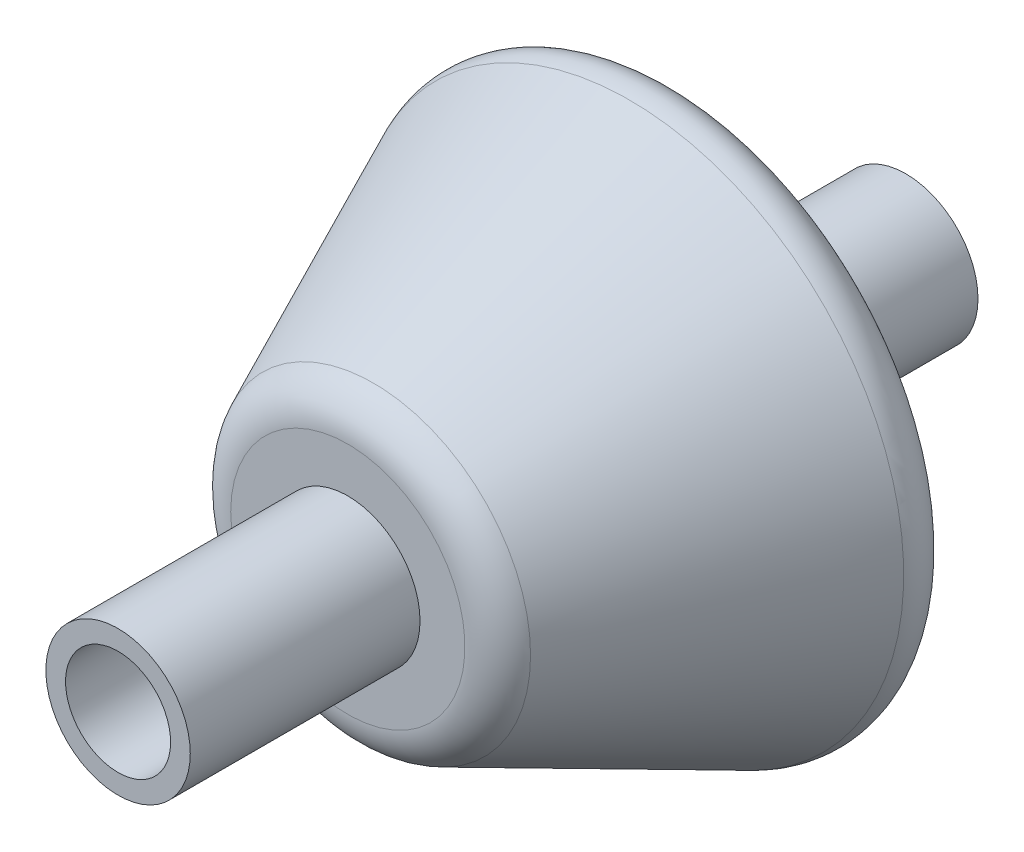
ISO-10303-21;
HEADER;
FILE_DESCRIPTION(('STEP AP214'),'2;1');
FILE_NAME('part.step','',(''),(''),'','','');
FILE_SCHEMA(('AUTOMOTIVE_DESIGN { 1 0 10303 214 1 1 1 1 }'));
ENDSEC;
DATA;
#1=APPLICATION_CONTEXT('core data for automotive mechanical design processes');
#2=APPLICATION_PROTOCOL_DEFINITION('international standard','automotive_design',2000,#1);
#3=PRODUCT_CONTEXT('',#1,'mechanical');
#4=PRODUCT('Part','Part','',(#3));
#5=PRODUCT_RELATED_PRODUCT_CATEGORY('part','',(#4));
#6=PRODUCT_DEFINITION_FORMATION('','',#4);
#7=PRODUCT_DEFINITION_CONTEXT('part definition',#1,'design');
#8=PRODUCT_DEFINITION('design','',#6,#7);
#9=PRODUCT_DEFINITION_SHAPE('','',#8);
#10=(LENGTH_UNIT() NAMED_UNIT(*) SI_UNIT(.MILLI.,.METRE.));
#11=(NAMED_UNIT(*) PLANE_ANGLE_UNIT() SI_UNIT($,.RADIAN.));
#12=(NAMED_UNIT(*) SI_UNIT($,.STERADIAN.) SOLID_ANGLE_UNIT());
#13=UNCERTAINTY_MEASURE_WITH_UNIT(LENGTH_MEASURE(1.E-05),#10,'distance_accuracy_value','');
#14=(GEOMETRIC_REPRESENTATION_CONTEXT(3) GLOBAL_UNCERTAINTY_ASSIGNED_CONTEXT((#13)) GLOBAL_UNIT_ASSIGNED_CONTEXT((#10,
#11,#12)) REPRESENTATION_CONTEXT('',''));
#15=CARTESIAN_POINT('',(0.,0.,0.));
#16=DIRECTION('',(0.,0.,1.));
#17=DIRECTION('',(1.,0.,0.));
#18=AXIS2_PLACEMENT_3D('',#15,#16,#17);
#19=CARTESIAN_POINT('',(0.,0.,60.));
#20=DIRECTION('',(0.,0.,-1.));
#21=DIRECTION('',(-1.,0.,0.));
#22=AXIS2_PLACEMENT_3D('',#19,#20,#21);
#23=CYLINDRICAL_SURFACE('',#22,11.);
#24=CARTESIAN_POINT('',(0.,0.,-25.));
#25=DIRECTION('',(0.,0.,-1.));
#26=DIRECTION('',(-1.,0.,0.));
#27=AXIS2_PLACEMENT_3D('',#24,#25,#26);
#28=CIRCLE('',#27,11.);
#29=CARTESIAN_POINT('',(-11.,0.,-25.));
#30=VERTEX_POINT('',#29);
#31=EDGE_CURVE('E55',#30,#30,#28,.T.);
#32=ORIENTED_EDGE('',*,*,#31,.T.);
#33=EDGE_LOOP('',(#32));
#34=FACE_BOUND('',#33,.T.);
#35=CARTESIAN_POINT('',(0.,0.,-60.));
#36=DIRECTION('',(0.,0.,1.));
#37=DIRECTION('',(1.,0.,0.));
#38=AXIS2_PLACEMENT_3D('',#35,#36,#37);
#39=CIRCLE('',#38,11.);
#40=CARTESIAN_POINT('',(11.,0.,-60.));
#41=VERTEX_POINT('',#40);
#42=EDGE_CURVE('E46',#41,#41,#39,.T.);
#43=ORIENTED_EDGE('',*,*,#42,.T.);
#44=EDGE_LOOP('',(#43));
#45=FACE_BOUND('',#44,.T.);
#46=ADVANCED_FACE('F31',(#34,#45),#23,.T.);
#47=CARTESIAN_POINT('',(0.,0.,60.));
#48=DIRECTION('',(0.,0.,-1.));
#49=DIRECTION('',(-1.,0.,0.));
#50=AXIS2_PLACEMENT_3D('',#47,#48,#49);
#51=CYLINDRICAL_SURFACE('',#50,8.);
#52=CARTESIAN_POINT('',(0.,0.,-25.));
#53=DIRECTION('',(0.,0.,-1.));
#54=DIRECTION('',(-1.,0.,0.));
#55=AXIS2_PLACEMENT_3D('',#52,#53,#54);
#56=CIRCLE('',#55,8.);
#57=CARTESIAN_POINT('',(-8.,0.,-25.));
#58=VERTEX_POINT('',#57);
#59=EDGE_CURVE('E10',#58,#58,#56,.T.);
#60=ORIENTED_EDGE('',*,*,#59,.F.);
#61=EDGE_LOOP('',(#60));
#62=FACE_BOUND('',#61,.T.);
#63=CARTESIAN_POINT('',(0.,0.,-60.));
#64=DIRECTION('',(0.,0.,1.));
#65=DIRECTION('',(1.,0.,0.));
#66=AXIS2_PLACEMENT_3D('',#63,#64,#65);
#67=CIRCLE('',#66,8.);
#68=CARTESIAN_POINT('',(8.,0.,-60.));
#69=VERTEX_POINT('',#68);
#70=EDGE_CURVE('E52',#69,#69,#67,.T.);
#71=ORIENTED_EDGE('',*,*,#70,.F.);
#72=EDGE_LOOP('',(#71));
#73=FACE_BOUND('',#72,.T.);
#74=ADVANCED_FACE('F96',(#62,#73),#51,.F.);
#75=CARTESIAN_POINT('',(0.,0.,-60.));
#76=DIRECTION('',(0.,0.,1.));
#77=DIRECTION('',(1.,0.,0.));
#78=AXIS2_PLACEMENT_3D('',#75,#76,#77);
#79=PLANE('',#78);
#80=ORIENTED_EDGE('',*,*,#42,.F.);
#81=EDGE_LOOP('',(#80));
#82=FACE_BOUND('',#81,.T.);
#83=ORIENTED_EDGE('',*,*,#70,.T.);
#84=EDGE_LOOP('',(#83));
#85=FACE_BOUND('',#84,.T.);
#86=ADVANCED_FACE('F101',(#82,#85),#79,.F.);
#87=CARTESIAN_POINT('',(0.,37.216326449726,-25.));
#88=DIRECTION('',(0.,0.,-1.));
#89=DIRECTION('',(-1.,0.,0.));
#90=AXIS2_PLACEMENT_3D('',#87,#88,#89);
#91=PLANE('',#90);
#92=ORIENTED_EDGE('',*,*,#59,.T.);
#93=EDGE_LOOP('',(#92));
#94=FACE_BOUND('',#93,.T.);
#95=ADVANCED_FACE('F110',(#94),#91,.T.);
#96=ORIENTED_EDGE('',*,*,#31,.F.);
#97=EDGE_LOOP('',(#96));
#98=FACE_BOUND('',#97,.T.);
#99=CARTESIAN_POINT('',(0.,0.,-25.));
#100=DIRECTION('',(0.,0.,-1.));
#101=DIRECTION('',(-1.,0.,0.));
#102=AXIS2_PLACEMENT_3D('',#99,#100,#101);
#103=CIRCLE('',#102,37.216326449726);
#104=CARTESIAN_POINT('',(-37.216326449726,0.,-25.));
#105=VERTEX_POINT('',#104);
#106=EDGE_CURVE('E63',#105,#105,#103,.T.);
#107=ORIENTED_EDGE('',*,*,#106,.T.);
#108=EDGE_LOOP('',(#107));
#109=FACE_BOUND('',#108,.T.);
#110=ADVANCED_FACE('F116',(#98,#109),#91,.T.);
#111=CARTESIAN_POINT('',(0.,0.,-20.));
#112=DIRECTION('',(0.,0.,-1.));
#113=DIRECTION('',(-1.,0.,0.));
#114=AXIS2_PLACEMENT_3D('',#111,#112,#113);
#115=TOROIDAL_SURFACE('',#114,37.2163264497261,5.);
#116=CARTESIAN_POINT('',(0.,0.,-17.9210530291395));
#117=DIRECTION('',(0.,0.,-1.));
#118=DIRECTION('',(-1.,0.,0.));
#119=AXIS2_PLACEMENT_3D('',#116,#117,#118);
#120=CIRCLE('',#119,41.7636310900982);
#121=CARTESIAN_POINT('',(-41.7636310900982,0.,-17.9210530291395));
#122=VERTEX_POINT('',#121);
#123=EDGE_CURVE('E66',#122,#122,#120,.T.);
#124=ORIENTED_EDGE('',*,*,#123,.T.);
#125=EDGE_LOOP('',(#124));
#126=FACE_BOUND('',#125,.T.);
#127=ORIENTED_EDGE('',*,*,#106,.F.);
#128=EDGE_LOOP('',(#127));
#129=FACE_BOUND('',#128,.T.);
#130=ADVANCED_FACE('F125',(#126,#129),#115,.T.);
#131=CARTESIAN_POINT('',(0.,0.,-17.9210530291395));
#132=DIRECTION('',(0.,0.,-1.));
#133=DIRECTION('',(-1.,0.,0.));
#134=AXIS2_PLACEMENT_3D('',#131,#132,#133);
#135=CONICAL_SURFACE('',#134,41.7636310900982,0.428810611235679);
#136=CARTESIAN_POINT('',(0.,0.,21.0887508770344));
#137=DIRECTION('',(0.,0.,-1.));
#138=DIRECTION('',(-1.,0.,0.));
#139=AXIS2_PLACEMENT_3D('',#136,#137,#138);
#140=CIRCLE('',#139,23.9290411344173);
#141=CARTESIAN_POINT('',(-23.9290411344173,0.,21.0887508770344));
#142=VERTEX_POINT('',#141);
#143=EDGE_CURVE('E69',#142,#142,#140,.T.);
#144=ORIENTED_EDGE('',*,*,#143,.T.);
#145=EDGE_LOOP('',(#144));
#146=FACE_BOUND('',#145,.T.);
#147=ORIENTED_EDGE('',*,*,#123,.F.);
#148=EDGE_LOOP('',(#147));
#149=FACE_BOUND('',#148,.T.);
#150=ADVANCED_FACE('F90',(#146,#149),#135,.T.);
#151=CARTESIAN_POINT('',(0.,0.,18.3050699799898));
#152=DIRECTION('',(0.,0.,-1.));
#153=DIRECTION('',(-1.,0.,0.));
#154=AXIS2_PLACEMENT_3D('',#151,#152,#153);
#155=TOROIDAL_SURFACE('',#154,17.8402638650255,6.69493002001024);
#156=CARTESIAN_POINT('',(0.,0.,25.));
#157=DIRECTION('',(0.,0.,-1.));
#158=DIRECTION('',(-1.,0.,0.));
#159=AXIS2_PLACEMENT_3D('',#156,#157,#158);
#160=CIRCLE('',#159,17.8402638650255);
#161=CARTESIAN_POINT('',(-17.8402638650255,0.,25.));
#162=VERTEX_POINT('',#161);
#163=EDGE_CURVE('E72',#162,#162,#160,.T.);
#164=ORIENTED_EDGE('',*,*,#163,.T.);
#165=EDGE_LOOP('',(#164));
#166=FACE_BOUND('',#165,.T.);
#167=ORIENTED_EDGE('',*,*,#143,.F.);
#168=EDGE_LOOP('',(#167));
#169=FACE_BOUND('',#168,.T.);
#170=ADVANCED_FACE('F76',(#166,#169),#155,.T.);
#171=CARTESIAN_POINT('',(0.,0.,25.));
#172=DIRECTION('',(0.,0.,1.));
#173=DIRECTION('',(1.,0.,0.));
#174=AXIS2_PLACEMENT_3D('',#171,#172,#173);
#175=PLANE('',#174);
#176=CARTESIAN_POINT('',(0.,0.,25.));
#177=DIRECTION('',(0.,0.,1.));
#178=DIRECTION('',(1.,0.,0.));
#179=AXIS2_PLACEMENT_3D('',#176,#177,#178);
#180=CIRCLE('',#179,11.);
#181=CARTESIAN_POINT('',(11.,0.,25.));
#182=VERTEX_POINT('',#181);
#183=EDGE_CURVE('E60',#182,#182,#180,.T.);
#184=ORIENTED_EDGE('',*,*,#183,.F.);
#185=EDGE_LOOP('',(#184));
#186=FACE_BOUND('',#185,.T.);
#187=ORIENTED_EDGE('',*,*,#163,.F.);
#188=EDGE_LOOP('',(#187));
#189=FACE_BOUND('',#188,.T.);
#190=ADVANCED_FACE('F79',(#186,#189),#175,.T.);
#191=ORIENTED_EDGE('',*,*,#183,.T.);
#192=EDGE_LOOP('',(#191));
#193=FACE_BOUND('',#192,.T.);
#194=CARTESIAN_POINT('',(0.,0.,60.));
#195=DIRECTION('',(0.,0.,1.));
#196=DIRECTION('',(1.,0.,0.));
#197=AXIS2_PLACEMENT_3D('',#194,#195,#196);
#198=CIRCLE('',#197,11.);
#199=CARTESIAN_POINT('',(11.,0.,60.));
#200=VERTEX_POINT('',#199);
#201=EDGE_CURVE('E42',#200,#200,#198,.T.);
#202=ORIENTED_EDGE('',*,*,#201,.F.);
#203=EDGE_LOOP('',(#202));
#204=FACE_BOUND('',#203,.T.);
#205=ADVANCED_FACE('F33',(#193,#204),#23,.T.);
#206=CARTESIAN_POINT('',(0.,0.,60.));
#207=DIRECTION('',(0.,0.,1.));
#208=DIRECTION('',(1.,0.,0.));
#209=AXIS2_PLACEMENT_3D('',#206,#207,#208);
#210=PLANE('',#209);
#211=ORIENTED_EDGE('',*,*,#201,.T.);
#212=EDGE_LOOP('',(#211));
#213=FACE_BOUND('',#212,.T.);
#214=CARTESIAN_POINT('',(0.,0.,60.));
#215=DIRECTION('',(0.,0.,1.));
#216=DIRECTION('',(1.,0.,0.));
#217=AXIS2_PLACEMENT_3D('',#214,#215,#216);
#218=CIRCLE('',#217,8.);
#219=CARTESIAN_POINT('',(8.,0.,60.));
#220=VERTEX_POINT('',#219);
#221=EDGE_CURVE('E50',#220,#220,#218,.T.);
#222=ORIENTED_EDGE('',*,*,#221,.F.);
#223=EDGE_LOOP('',(#222));
#224=FACE_BOUND('',#223,.T.);
#225=ADVANCED_FACE('F88',(#213,#224),#210,.T.);
#226=CARTESIAN_POINT('',(0.,0.,25.));
#227=DIRECTION('',(0.,0.,1.));
#228=DIRECTION('',(1.,0.,0.));
#229=AXIS2_PLACEMENT_3D('',#226,#227,#228);
#230=CIRCLE('',#229,8.);
#231=CARTESIAN_POINT('',(8.,0.,25.));
#232=VERTEX_POINT('',#231);
#233=EDGE_CURVE('E38',#232,#232,#230,.T.);
#234=ORIENTED_EDGE('',*,*,#233,.F.);
#235=EDGE_LOOP('',(#234));
#236=FACE_BOUND('',#235,.T.);
#237=ORIENTED_EDGE('',*,*,#221,.T.);
#238=EDGE_LOOP('',(#237));
#239=FACE_BOUND('',#238,.T.);
#240=ADVANCED_FACE('F94',(#236,#239),#51,.F.);
#241=ORIENTED_EDGE('',*,*,#233,.T.);
#242=EDGE_LOOP('',(#241));
#243=FACE_BOUND('',#242,.T.);
#244=ADVANCED_FACE('F83',(#243),#175,.T.);
#245=CLOSED_SHELL('',(#46,#74,#86,#95,#110,#130,#150,#170,#190,#205,#225,#240,#244));
#246=MANIFOLD_SOLID_BREP('B2',#245);
#247=ADVANCED_BREP_SHAPE_REPRESENTATION('',(#18,#246),#14);
#248=SHAPE_DEFINITION_REPRESENTATION(#9,#247);
ENDSEC;
END-ISO-10303-21;
